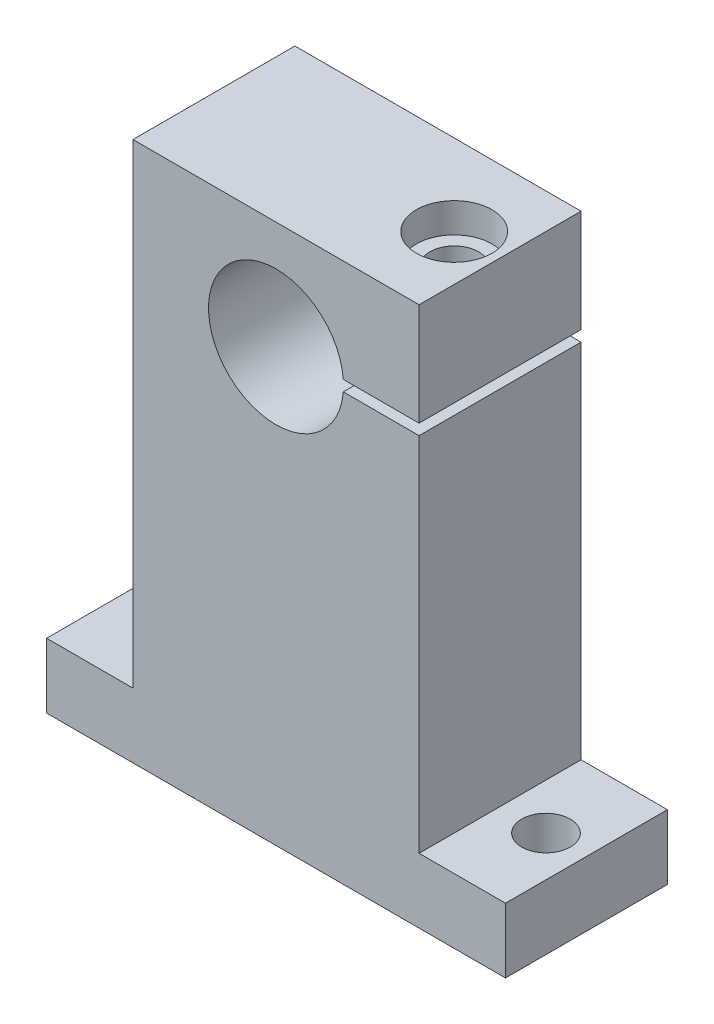
ISO-10303-21;
HEADER;
FILE_DESCRIPTION(('STEP AP214'),'2;1');
FILE_NAME('part.step','',(''),(''),'','','');
FILE_SCHEMA(('AUTOMOTIVE_DESIGN { 1 0 10303 214 1 1 1 1 }'));
ENDSEC;
DATA;
#1=APPLICATION_CONTEXT('core data for automotive mechanical design processes');
#2=APPLICATION_PROTOCOL_DEFINITION('international standard','automotive_design',2000,#1);
#3=PRODUCT_CONTEXT('',#1,'mechanical');
#4=PRODUCT('Part','Part','',(#3));
#5=PRODUCT_RELATED_PRODUCT_CATEGORY('part','',(#4));
#6=PRODUCT_DEFINITION_FORMATION('','',#4);
#7=PRODUCT_DEFINITION_CONTEXT('part definition',#1,'design');
#8=PRODUCT_DEFINITION('design','',#6,#7);
#9=PRODUCT_DEFINITION_SHAPE('','',#8);
#10=(LENGTH_UNIT() NAMED_UNIT(*) SI_UNIT(.MILLI.,.METRE.));
#11=(NAMED_UNIT(*) PLANE_ANGLE_UNIT() SI_UNIT($,.RADIAN.));
#12=(NAMED_UNIT(*) SI_UNIT($,.STERADIAN.) SOLID_ANGLE_UNIT());
#13=UNCERTAINTY_MEASURE_WITH_UNIT(LENGTH_MEASURE(1.E-05),#10,'distance_accuracy_value','');
#14=(GEOMETRIC_REPRESENTATION_CONTEXT(3) GLOBAL_UNCERTAINTY_ASSIGNED_CONTEXT((#13)) GLOBAL_UNIT_ASSIGNED_CONTEXT((#10,
#11,#12)) REPRESENTATION_CONTEXT('',''));
#15=CARTESIAN_POINT('',(0.,0.,0.));
#16=DIRECTION('',(0.,0.,1.));
#17=DIRECTION('',(1.,0.,0.));
#18=AXIS2_PLACEMENT_3D('',#15,#16,#17);
#19=CARTESIAN_POINT('',(26.5,12.,15.));
#20=DIRECTION('',(-1.,0.,0.));
#21=DIRECTION('',(0.,-1.,0.));
#22=AXIS2_PLACEMENT_3D('',#19,#20,#21);
#23=PLANE('',#22);
#24=DIRECTION('',(0.,1.,0.));
#25=VECTOR('',#24,1.);
#26=CARTESIAN_POINT('',(26.5,12.,15.));
#27=LINE('',#26,#25);
#28=CARTESIAN_POINT('',(26.5,81.,15.));
#29=VERTEX_POINT('',#28);
#30=CARTESIAN_POINT('',(26.5,100.,15.));
#31=VERTEX_POINT('',#30);
#32=EDGE_CURVE('E183',#29,#31,#27,.T.);
#33=ORIENTED_EDGE('',*,*,#32,.F.);
#34=DIRECTION('',(0.,0.,-1.));
#35=VECTOR('',#34,1.);
#36=CARTESIAN_POINT('',(26.5,81.,15.));
#37=LINE('',#36,#35);
#38=CARTESIAN_POINT('',(26.5,81.,-15.));
#39=VERTEX_POINT('',#38);
#40=EDGE_CURVE('E155',#29,#39,#37,.T.);
#41=ORIENTED_EDGE('',*,*,#40,.T.);
#42=DIRECTION('',(0.,1.,0.));
#43=VECTOR('',#42,1.);
#44=CARTESIAN_POINT('',(26.5,12.,-15.));
#45=LINE('',#44,#43);
#46=CARTESIAN_POINT('',(26.5,100.,-15.));
#47=VERTEX_POINT('',#46);
#48=EDGE_CURVE('E202',#39,#47,#45,.T.);
#49=ORIENTED_EDGE('',*,*,#48,.T.);
#50=DIRECTION('',(0.,0.,-1.));
#51=VECTOR('',#50,1.);
#52=CARTESIAN_POINT('',(26.5,100.,15.));
#53=LINE('',#52,#51);
#54=EDGE_CURVE('E219',#31,#47,#53,.T.);
#55=ORIENTED_EDGE('',*,*,#54,.F.);
#56=EDGE_LOOP('',(#33,#41,#49,#55));
#57=FACE_BOUND('',#56,.T.);
#58=ADVANCED_FACE('F36',(#57),#23,.F.);
#59=CARTESIAN_POINT('',(-42.5,12.,15.));
#60=DIRECTION('',(0.,0.,-1.));
#61=DIRECTION('',(-1.,0.,0.));
#62=AXIS2_PLACEMENT_3D('',#59,#60,#61);
#63=PLANE('',#62);
#64=CARTESIAN_POINT('',(0.,80.,15.));
#65=DIRECTION('',(0.,0.,1.));
#66=DIRECTION('',(1.,0.,0.));
#67=AXIS2_PLACEMENT_3D('',#64,#65,#66);
#68=CIRCLE('',#67,12.5);
#69=CARTESIAN_POINT('',(12.4599357943771,81.,15.));
#70=VERTEX_POINT('',#69);
#71=CARTESIAN_POINT('',(12.4599357943771,79.,15.));
#72=VERTEX_POINT('',#71);
#73=EDGE_CURVE('E166',#70,#72,#68,.T.);
#74=ORIENTED_EDGE('',*,*,#73,.F.);
#75=DIRECTION('',(-1.,0.,0.));
#76=VECTOR('',#75,1.);
#77=CARTESIAN_POINT('',(60.3456073208911,81.,15.));
#78=LINE('',#77,#76);
#79=EDGE_CURVE('E58',#29,#70,#78,.T.);
#80=ORIENTED_EDGE('',*,*,#79,.F.);
#81=ORIENTED_EDGE('',*,*,#32,.T.);
#82=DIRECTION('',(-1.,0.,0.));
#83=VECTOR('',#82,1.);
#84=CARTESIAN_POINT('',(-26.5,100.,15.));
#85=LINE('',#84,#83);
#86=CARTESIAN_POINT('',(-26.5,100.,15.));
#87=VERTEX_POINT('',#86);
#88=EDGE_CURVE('E187',#31,#87,#85,.T.);
#89=ORIENTED_EDGE('',*,*,#88,.T.);
#90=DIRECTION('',(0.,-1.,0.));
#91=VECTOR('',#90,1.);
#92=CARTESIAN_POINT('',(-26.5,12.,15.));
#93=LINE('',#92,#91);
#94=CARTESIAN_POINT('',(-26.5,12.,15.));
#95=VERTEX_POINT('',#94);
#96=EDGE_CURVE('E189',#87,#95,#93,.T.);
#97=ORIENTED_EDGE('',*,*,#96,.T.);
#98=DIRECTION('',(-1.,0.,0.));
#99=VECTOR('',#98,1.);
#100=CARTESIAN_POINT('',(-42.5,12.,15.));
#101=LINE('',#100,#99);
#102=CARTESIAN_POINT('',(-42.5,12.,15.));
#103=VERTEX_POINT('',#102);
#104=EDGE_CURVE('E191',#95,#103,#101,.T.);
#105=ORIENTED_EDGE('',*,*,#104,.T.);
#106=DIRECTION('',(0.,-1.,0.));
#107=VECTOR('',#106,1.);
#108=CARTESIAN_POINT('',(-42.5,0.,15.));
#109=LINE('',#108,#107);
#110=CARTESIAN_POINT('',(-42.5,0.,15.));
#111=VERTEX_POINT('',#110);
#112=EDGE_CURVE('E173',#103,#111,#109,.T.);
#113=ORIENTED_EDGE('',*,*,#112,.T.);
#114=DIRECTION('',(1.,0.,0.));
#115=VECTOR('',#114,1.);
#116=CARTESIAN_POINT('',(42.5,0.,15.));
#117=LINE('',#116,#115);
#118=CARTESIAN_POINT('',(42.5,0.,15.));
#119=VERTEX_POINT('',#118);
#120=EDGE_CURVE('E176',#111,#119,#117,.T.);
#121=ORIENTED_EDGE('',*,*,#120,.T.);
#122=DIRECTION('',(0.,1.,0.));
#123=VECTOR('',#122,1.);
#124=CARTESIAN_POINT('',(42.5,0.,15.));
#125=LINE('',#124,#123);
#126=CARTESIAN_POINT('',(42.5,12.,15.));
#127=VERTEX_POINT('',#126);
#128=EDGE_CURVE('E179',#119,#127,#125,.T.);
#129=ORIENTED_EDGE('',*,*,#128,.T.);
#130=DIRECTION('',(-1.,0.,0.));
#131=VECTOR('',#130,1.);
#132=CARTESIAN_POINT('',(42.5,12.,15.));
#133=LINE('',#132,#131);
#134=CARTESIAN_POINT('',(26.5,12.,15.));
#135=VERTEX_POINT('',#134);
#136=EDGE_CURVE('E181',#127,#135,#133,.T.);
#137=ORIENTED_EDGE('',*,*,#136,.T.);
#138=CARTESIAN_POINT('',(26.5,79.,15.));
#139=VERTEX_POINT('',#138);
#140=EDGE_CURVE('E184',#135,#139,#27,.T.);
#141=ORIENTED_EDGE('',*,*,#140,.T.);
#142=DIRECTION('',(1.,0.,0.));
#143=VECTOR('',#142,1.);
#144=CARTESIAN_POINT('',(60.3456073208911,79.,15.));
#145=LINE('',#144,#143);
#146=EDGE_CURVE('E139',#72,#139,#145,.T.);
#147=ORIENTED_EDGE('',*,*,#146,.F.);
#148=EDGE_LOOP('',(#74,#80,#81,#89,#97,#105,#113,#121,#129,#137,#141,#147));
#149=FACE_BOUND('',#148,.T.);
#150=ADVANCED_FACE('F243',(#149),#63,.F.);
#151=CARTESIAN_POINT('',(-42.5,12.,-15.));
#152=DIRECTION('',(0.,0.,-1.));
#153=DIRECTION('',(-1.,0.,0.));
#154=AXIS2_PLACEMENT_3D('',#151,#152,#153);
#155=PLANE('',#154);
#156=DIRECTION('',(-1.,0.,0.));
#157=VECTOR('',#156,1.);
#158=CARTESIAN_POINT('',(60.3456073208911,81.,-15.));
#159=LINE('',#158,#157);
#160=CARTESIAN_POINT('',(12.4599357943771,81.,-15.));
#161=VERTEX_POINT('',#160);
#162=EDGE_CURVE('E147',#39,#161,#159,.T.);
#163=ORIENTED_EDGE('',*,*,#162,.T.);
#164=CARTESIAN_POINT('',(0.,80.,-15.));
#165=DIRECTION('',(0.,0.,1.));
#166=DIRECTION('',(1.,0.,0.));
#167=AXIS2_PLACEMENT_3D('',#164,#165,#166);
#168=CIRCLE('',#167,12.5);
#169=CARTESIAN_POINT('',(12.4599357943771,79.,-15.));
#170=VERTEX_POINT('',#169);
#171=EDGE_CURVE('E170',#161,#170,#168,.T.);
#172=ORIENTED_EDGE('',*,*,#171,.T.);
#173=DIRECTION('',(1.,0.,0.));
#174=VECTOR('',#173,1.);
#175=CARTESIAN_POINT('',(60.3456073208911,79.,-15.));
#176=LINE('',#175,#174);
#177=CARTESIAN_POINT('',(26.5,79.,-15.));
#178=VERTEX_POINT('',#177);
#179=EDGE_CURVE('E51',#170,#178,#176,.T.);
#180=ORIENTED_EDGE('',*,*,#179,.T.);
#181=CARTESIAN_POINT('',(26.5,12.,-15.));
#182=VERTEX_POINT('',#181);
#183=EDGE_CURVE('E203',#182,#178,#45,.T.);
#184=ORIENTED_EDGE('',*,*,#183,.F.);
#185=DIRECTION('',(-1.,0.,0.));
#186=VECTOR('',#185,1.);
#187=CARTESIAN_POINT('',(42.5,12.,-15.));
#188=LINE('',#187,#186);
#189=CARTESIAN_POINT('',(42.5,12.,-15.));
#190=VERTEX_POINT('',#189);
#191=EDGE_CURVE('E200',#190,#182,#188,.T.);
#192=ORIENTED_EDGE('',*,*,#191,.F.);
#193=DIRECTION('',(0.,1.,0.));
#194=VECTOR('',#193,1.);
#195=CARTESIAN_POINT('',(42.5,0.,-15.));
#196=LINE('',#195,#194);
#197=CARTESIAN_POINT('',(42.5,0.,-15.));
#198=VERTEX_POINT('',#197);
#199=EDGE_CURVE('E198',#198,#190,#196,.T.);
#200=ORIENTED_EDGE('',*,*,#199,.F.);
#201=DIRECTION('',(1.,0.,0.));
#202=VECTOR('',#201,1.);
#203=CARTESIAN_POINT('',(42.5,0.,-15.));
#204=LINE('',#203,#202);
#205=CARTESIAN_POINT('',(-42.5,0.,-15.));
#206=VERTEX_POINT('',#205);
#207=EDGE_CURVE('E196',#206,#198,#204,.T.);
#208=ORIENTED_EDGE('',*,*,#207,.F.);
#209=DIRECTION('',(0.,-1.,0.));
#210=VECTOR('',#209,1.);
#211=CARTESIAN_POINT('',(-42.5,0.,-15.));
#212=LINE('',#211,#210);
#213=CARTESIAN_POINT('',(-42.5,12.,-15.));
#214=VERTEX_POINT('',#213);
#215=EDGE_CURVE('E169',#214,#206,#212,.T.);
#216=ORIENTED_EDGE('',*,*,#215,.F.);
#217=DIRECTION('',(-1.,0.,0.));
#218=VECTOR('',#217,1.);
#219=CARTESIAN_POINT('',(-42.5,12.,-15.));
#220=LINE('',#219,#218);
#221=CARTESIAN_POINT('',(-26.5,12.,-15.));
#222=VERTEX_POINT('',#221);
#223=EDGE_CURVE('E177',#222,#214,#220,.T.);
#224=ORIENTED_EDGE('',*,*,#223,.F.);
#225=DIRECTION('',(0.,-1.,0.));
#226=VECTOR('',#225,1.);
#227=CARTESIAN_POINT('',(-26.5,12.,-15.));
#228=LINE('',#227,#226);
#229=CARTESIAN_POINT('',(-26.5,100.,-15.));
#230=VERTEX_POINT('',#229);
#231=EDGE_CURVE('E208',#230,#222,#228,.T.);
#232=ORIENTED_EDGE('',*,*,#231,.F.);
#233=DIRECTION('',(-1.,0.,0.));
#234=VECTOR('',#233,1.);
#235=CARTESIAN_POINT('',(-26.5,100.,-15.));
#236=LINE('',#235,#234);
#237=EDGE_CURVE('E206',#47,#230,#236,.T.);
#238=ORIENTED_EDGE('',*,*,#237,.F.);
#239=ORIENTED_EDGE('',*,*,#48,.F.);
#240=EDGE_LOOP('',(#163,#172,#180,#184,#192,#200,#208,#216,#224,#232,#238,#239));
#241=FACE_BOUND('',#240,.T.);
#242=ADVANCED_FACE('F249',(#241),#155,.T.);
#243=CARTESIAN_POINT('',(-42.5,0.,15.));
#244=DIRECTION('',(1.,0.,0.));
#245=DIRECTION('',(0.,1.,0.));
#246=AXIS2_PLACEMENT_3D('',#243,#244,#245);
#247=PLANE('',#246);
#248=ORIENTED_EDGE('',*,*,#215,.T.);
#249=DIRECTION('',(0.,0.,-1.));
#250=VECTOR('',#249,1.);
#251=CARTESIAN_POINT('',(-42.5,0.,15.));
#252=LINE('',#251,#250);
#253=EDGE_CURVE('E231',#111,#206,#252,.T.);
#254=ORIENTED_EDGE('',*,*,#253,.F.);
#255=ORIENTED_EDGE('',*,*,#112,.F.);
#256=DIRECTION('',(0.,0.,-1.));
#257=VECTOR('',#256,1.);
#258=CARTESIAN_POINT('',(-42.5,12.,15.));
#259=LINE('',#258,#257);
#260=EDGE_CURVE('E193',#103,#214,#259,.T.);
#261=ORIENTED_EDGE('',*,*,#260,.T.);
#262=EDGE_LOOP('',(#248,#254,#255,#261));
#263=FACE_BOUND('',#262,.T.);
#264=ADVANCED_FACE('F38',(#263),#247,.F.);
#265=CARTESIAN_POINT('',(42.5,0.,15.));
#266=DIRECTION('',(0.,1.,0.));
#267=DIRECTION('',(-1.,0.,0.));
#268=AXIS2_PLACEMENT_3D('',#265,#266,#267);
#269=PLANE('',#268);
#270=CARTESIAN_POINT('',(-35.,0.,0.));
#271=DIRECTION('',(0.,-1.,0.));
#272=DIRECTION('',(0.,0.,-1.));
#273=AXIS2_PLACEMENT_3D('',#270,#271,#272);
#274=CIRCLE('',#273,4.50000000000001);
#275=CARTESIAN_POINT('',(-35.,0.,-4.50000000000001));
#276=VERTEX_POINT('',#275);
#277=EDGE_CURVE('E158',#276,#276,#274,.T.);
#278=ORIENTED_EDGE('',*,*,#277,.F.);
#279=EDGE_LOOP('',(#278));
#280=FACE_BOUND('',#279,.T.);
#281=CARTESIAN_POINT('',(35.,0.,0.));
#282=DIRECTION('',(0.,-1.,0.));
#283=DIRECTION('',(0.,0.,-1.));
#284=AXIS2_PLACEMENT_3D('',#281,#282,#283);
#285=CIRCLE('',#284,4.50000000000001);
#286=CARTESIAN_POINT('',(35.,0.,-4.50000000000001));
#287=VERTEX_POINT('',#286);
#288=EDGE_CURVE('E162',#287,#287,#285,.T.);
#289=ORIENTED_EDGE('',*,*,#288,.F.);
#290=EDGE_LOOP('',(#289));
#291=FACE_BOUND('',#290,.T.);
#292=ORIENTED_EDGE('',*,*,#207,.T.);
#293=DIRECTION('',(0.,0.,-1.));
#294=VECTOR('',#293,1.);
#295=CARTESIAN_POINT('',(42.5,0.,15.));
#296=LINE('',#295,#294);
#297=EDGE_CURVE('E228',#119,#198,#296,.T.);
#298=ORIENTED_EDGE('',*,*,#297,.F.);
#299=ORIENTED_EDGE('',*,*,#120,.F.);
#300=ORIENTED_EDGE('',*,*,#253,.T.);
#301=EDGE_LOOP('',(#292,#298,#299,#300));
#302=FACE_BOUND('',#301,.T.);
#303=ADVANCED_FACE('F276',(#280,#291,#302),#269,.F.);
#304=CARTESIAN_POINT('',(42.5,0.,15.));
#305=DIRECTION('',(-1.,0.,0.));
#306=DIRECTION('',(0.,-1.,0.));
#307=AXIS2_PLACEMENT_3D('',#304,#305,#306);
#308=PLANE('',#307);
#309=ORIENTED_EDGE('',*,*,#199,.T.);
#310=DIRECTION('',(0.,0.,-1.));
#311=VECTOR('',#310,1.);
#312=CARTESIAN_POINT('',(42.5,12.,15.));
#313=LINE('',#312,#311);
#314=EDGE_CURVE('E225',#127,#190,#313,.T.);
#315=ORIENTED_EDGE('',*,*,#314,.F.);
#316=ORIENTED_EDGE('',*,*,#128,.F.);
#317=ORIENTED_EDGE('',*,*,#297,.T.);
#318=EDGE_LOOP('',(#309,#315,#316,#317));
#319=FACE_BOUND('',#318,.T.);
#320=ADVANCED_FACE('F279',(#319),#308,.F.);
#321=CARTESIAN_POINT('',(42.5,12.,15.));
#322=DIRECTION('',(0.,-1.,0.));
#323=DIRECTION('',(1.,0.,0.));
#324=AXIS2_PLACEMENT_3D('',#321,#322,#323);
#325=PLANE('',#324);
#326=CARTESIAN_POINT('',(35.,12.,0.));
#327=DIRECTION('',(0.,-1.,0.));
#328=DIRECTION('',(1.,0.,0.));
#329=AXIS2_PLACEMENT_3D('',#326,#327,#328);
#330=CIRCLE('',#329,4.50000000000001);
#331=CARTESIAN_POINT('',(39.5,12.,0.));
#332=VERTEX_POINT('',#331);
#333=EDGE_CURVE('E165',#332,#332,#330,.T.);
#334=ORIENTED_EDGE('',*,*,#333,.T.);
#335=EDGE_LOOP('',(#334));
#336=FACE_BOUND('',#335,.T.);
#337=ORIENTED_EDGE('',*,*,#191,.T.);
#338=DIRECTION('',(0.,0.,-1.));
#339=VECTOR('',#338,1.);
#340=CARTESIAN_POINT('',(26.5,12.,15.));
#341=LINE('',#340,#339);
#342=EDGE_CURVE('E222',#135,#182,#341,.T.);
#343=ORIENTED_EDGE('',*,*,#342,.F.);
#344=ORIENTED_EDGE('',*,*,#136,.F.);
#345=ORIENTED_EDGE('',*,*,#314,.T.);
#346=EDGE_LOOP('',(#337,#343,#344,#345));
#347=FACE_BOUND('',#346,.T.);
#348=ADVANCED_FACE('F284',(#336,#347),#325,.F.);
#349=ORIENTED_EDGE('',*,*,#183,.T.);
#350=DIRECTION('',(0.,0.,1.));
#351=VECTOR('',#350,1.);
#352=CARTESIAN_POINT('',(26.5,79.,15.));
#353=LINE('',#352,#351);
#354=EDGE_CURVE('E150',#178,#139,#353,.T.);
#355=ORIENTED_EDGE('',*,*,#354,.T.);
#356=ORIENTED_EDGE('',*,*,#140,.F.);
#357=ORIENTED_EDGE('',*,*,#342,.T.);
#358=EDGE_LOOP('',(#349,#355,#356,#357));
#359=FACE_BOUND('',#358,.T.);
#360=ADVANCED_FACE('F287',(#359),#23,.F.);
#361=CARTESIAN_POINT('',(-26.5,100.,15.));
#362=DIRECTION('',(0.,-1.,0.));
#363=DIRECTION('',(0.,0.,-1.));
#364=AXIS2_PLACEMENT_3D('',#361,#362,#363);
#365=PLANE('',#364);
#366=CARTESIAN_POINT('',(18.,100.,0.));
#367=DIRECTION('',(0.,1.,0.));
#368=DIRECTION('',(0.,0.,1.));
#369=AXIS2_PLACEMENT_3D('',#366,#367,#368);
#370=CIRCLE('',#369,7.);
#371=CARTESIAN_POINT('',(18.,100.,7.));
#372=VERTEX_POINT('',#371);
#373=EDGE_CURVE('E142',#372,#372,#370,.T.);
#374=ORIENTED_EDGE('',*,*,#373,.F.);
#375=EDGE_LOOP('',(#374));
#376=FACE_BOUND('',#375,.T.);
#377=ORIENTED_EDGE('',*,*,#237,.T.);
#378=DIRECTION('',(0.,0.,-1.));
#379=VECTOR('',#378,1.);
#380=CARTESIAN_POINT('',(-26.5,100.,15.));
#381=LINE('',#380,#379);
#382=EDGE_CURVE('E216',#87,#230,#381,.T.);
#383=ORIENTED_EDGE('',*,*,#382,.F.);
#384=ORIENTED_EDGE('',*,*,#88,.F.);
#385=ORIENTED_EDGE('',*,*,#54,.T.);
#386=EDGE_LOOP('',(#377,#383,#384,#385));
#387=FACE_BOUND('',#386,.T.);
#388=ADVANCED_FACE('F257',(#376,#387),#365,.F.);
#389=CARTESIAN_POINT('',(-26.5,12.,15.));
#390=DIRECTION('',(1.,0.,0.));
#391=DIRECTION('',(0.,0.,-1.));
#392=AXIS2_PLACEMENT_3D('',#389,#390,#391);
#393=PLANE('',#392);
#394=ORIENTED_EDGE('',*,*,#231,.T.);
#395=DIRECTION('',(0.,0.,-1.));
#396=VECTOR('',#395,1.);
#397=CARTESIAN_POINT('',(-26.5,12.,15.));
#398=LINE('',#397,#396);
#399=EDGE_CURVE('E213',#95,#222,#398,.T.);
#400=ORIENTED_EDGE('',*,*,#399,.F.);
#401=ORIENTED_EDGE('',*,*,#96,.F.);
#402=ORIENTED_EDGE('',*,*,#382,.T.);
#403=EDGE_LOOP('',(#394,#400,#401,#402));
#404=FACE_BOUND('',#403,.T.);
#405=ADVANCED_FACE('F264',(#404),#393,.F.);
#406=CARTESIAN_POINT('',(-42.5,12.,15.));
#407=DIRECTION('',(0.,-1.,0.));
#408=DIRECTION('',(0.,0.,-1.));
#409=AXIS2_PLACEMENT_3D('',#406,#407,#408);
#410=PLANE('',#409);
#411=CARTESIAN_POINT('',(-35.,12.,0.));
#412=DIRECTION('',(0.,-1.,0.));
#413=DIRECTION('',(0.,0.,-1.));
#414=AXIS2_PLACEMENT_3D('',#411,#412,#413);
#415=CIRCLE('',#414,4.50000000000001);
#416=CARTESIAN_POINT('',(-35.,12.,-4.50000000000001));
#417=VERTEX_POINT('',#416);
#418=EDGE_CURVE('E161',#417,#417,#415,.T.);
#419=ORIENTED_EDGE('',*,*,#418,.T.);
#420=EDGE_LOOP('',(#419));
#421=FACE_BOUND('',#420,.T.);
#422=ORIENTED_EDGE('',*,*,#223,.T.);
#423=ORIENTED_EDGE('',*,*,#260,.F.);
#424=ORIENTED_EDGE('',*,*,#104,.F.);
#425=ORIENTED_EDGE('',*,*,#399,.T.);
#426=EDGE_LOOP('',(#422,#423,#424,#425));
#427=FACE_BOUND('',#426,.T.);
#428=ADVANCED_FACE('F267',(#421,#427),#410,.F.);
#429=CARTESIAN_POINT('',(0.,80.,15.));
#430=DIRECTION('',(0.,0.,-1.));
#431=DIRECTION('',(-1.,0.,0.));
#432=AXIS2_PLACEMENT_3D('',#429,#430,#431);
#433=CYLINDRICAL_SURFACE('',#432,12.5);
#434=DIRECTION('',(0.,0.,-1.));
#435=VECTOR('',#434,1.);
#436=CARTESIAN_POINT('',(12.4599357943771,81.,15.));
#437=LINE('',#436,#435);
#438=EDGE_CURVE('E11',#70,#161,#437,.T.);
#439=ORIENTED_EDGE('',*,*,#438,.F.);
#440=ORIENTED_EDGE('',*,*,#73,.T.);
#441=DIRECTION('',(0.,0.,-1.));
#442=VECTOR('',#441,1.);
#443=CARTESIAN_POINT('',(12.4599357943771,79.,15.));
#444=LINE('',#443,#442);
#445=EDGE_CURVE('E44',#170,#72,#444,.F.);
#446=ORIENTED_EDGE('',*,*,#445,.F.);
#447=ORIENTED_EDGE('',*,*,#171,.F.);
#448=EDGE_LOOP('',(#439,#440,#446,#447));
#449=FACE_BOUND('',#448,.T.);
#450=ADVANCED_FACE('F245',(#449),#433,.F.);
#451=CARTESIAN_POINT('',(35.,0.,0.));
#452=DIRECTION('',(0.,-1.,0.));
#453=DIRECTION('',(0.,0.,-1.));
#454=AXIS2_PLACEMENT_3D('',#451,#452,#453);
#455=CYLINDRICAL_SURFACE('',#454,4.50000000000001);
#456=ORIENTED_EDGE('',*,*,#288,.T.);
#457=EDGE_LOOP('',(#456));
#458=FACE_BOUND('',#457,.T.);
#459=ORIENTED_EDGE('',*,*,#333,.F.);
#460=EDGE_LOOP('',(#459));
#461=FACE_BOUND('',#460,.T.);
#462=ADVANCED_FACE('F328',(#458,#461),#455,.F.);
#463=CARTESIAN_POINT('',(-35.,0.,0.));
#464=DIRECTION('',(0.,-1.,0.));
#465=DIRECTION('',(0.,0.,-1.));
#466=AXIS2_PLACEMENT_3D('',#463,#464,#465);
#467=CYLINDRICAL_SURFACE('',#466,4.50000000000001);
#468=ORIENTED_EDGE('',*,*,#277,.T.);
#469=EDGE_LOOP('',(#468));
#470=FACE_BOUND('',#469,.T.);
#471=ORIENTED_EDGE('',*,*,#418,.F.);
#472=EDGE_LOOP('',(#471));
#473=FACE_BOUND('',#472,.T.);
#474=ADVANCED_FACE('F334',(#470,#473),#467,.F.);
#475=CARTESIAN_POINT('',(60.3456073208911,79.,-15.));
#476=DIRECTION('',(0.,-1.,0.));
#477=DIRECTION('',(1.,0.,0.));
#478=AXIS2_PLACEMENT_3D('',#475,#476,#477);
#479=PLANE('',#478);
#480=CARTESIAN_POINT('',(18.,79.,0.));
#481=DIRECTION('',(0.,-1.,0.));
#482=DIRECTION('',(1.,0.,0.));
#483=AXIS2_PLACEMENT_3D('',#480,#481,#482);
#484=CIRCLE('',#483,4.24999999999999);
#485=CARTESIAN_POINT('',(22.25,79.,0.));
#486=VERTEX_POINT('',#485);
#487=EDGE_CURVE('E135',#486,#486,#484,.T.);
#488=ORIENTED_EDGE('',*,*,#487,.T.);
#489=EDGE_LOOP('',(#488));
#490=FACE_BOUND('',#489,.T.);
#491=ORIENTED_EDGE('',*,*,#179,.F.);
#492=ORIENTED_EDGE('',*,*,#445,.T.);
#493=ORIENTED_EDGE('',*,*,#146,.T.);
#494=ORIENTED_EDGE('',*,*,#354,.F.);
#495=EDGE_LOOP('',(#491,#492,#493,#494));
#496=FACE_BOUND('',#495,.T.);
#497=ADVANCED_FACE('F238',(#490,#496),#479,.F.);
#498=CARTESIAN_POINT('',(60.3456073208911,81.,-15.));
#499=DIRECTION('',(0.,1.,0.));
#500=DIRECTION('',(-1.,0.,0.));
#501=AXIS2_PLACEMENT_3D('',#498,#499,#500);
#502=PLANE('',#501);
#503=CARTESIAN_POINT('',(18.,81.,0.));
#504=DIRECTION('',(0.,1.,0.));
#505=DIRECTION('',(-1.,0.,0.));
#506=AXIS2_PLACEMENT_3D('',#503,#504,#505);
#507=CIRCLE('',#506,4.5);
#508=CARTESIAN_POINT('',(13.5,81.,0.));
#509=VERTEX_POINT('',#508);
#510=EDGE_CURVE('E521',#509,#509,#507,.F.);
#511=ORIENTED_EDGE('',*,*,#510,.F.);
#512=EDGE_LOOP('',(#511));
#513=FACE_BOUND('',#512,.T.);
#514=ORIENTED_EDGE('',*,*,#79,.T.);
#515=ORIENTED_EDGE('',*,*,#438,.T.);
#516=ORIENTED_EDGE('',*,*,#162,.F.);
#517=ORIENTED_EDGE('',*,*,#40,.F.);
#518=EDGE_LOOP('',(#514,#515,#516,#517));
#519=FACE_BOUND('',#518,.T.);
#520=ADVANCED_FACE('F246',(#513,#519),#502,.F.);
#521=CARTESIAN_POINT('',(18.,100.,0.));
#522=DIRECTION('',(0.,1.,0.));
#523=DIRECTION('',(0.,0.,1.));
#524=AXIS2_PLACEMENT_3D('',#521,#522,#523);
#525=CYLINDRICAL_SURFACE('',#524,7.);
#526=CARTESIAN_POINT('',(18.,94.5,0.));
#527=DIRECTION('',(0.,1.,0.));
#528=DIRECTION('',(0.,0.,1.));
#529=AXIS2_PLACEMENT_3D('',#526,#527,#528);
#530=CIRCLE('',#529,7.);
#531=CARTESIAN_POINT('',(18.,94.5,7.));
#532=VERTEX_POINT('',#531);
#533=EDGE_CURVE('E136',#532,#532,#530,.T.);
#534=ORIENTED_EDGE('',*,*,#533,.F.);
#535=EDGE_LOOP('',(#534));
#536=FACE_BOUND('',#535,.T.);
#537=ORIENTED_EDGE('',*,*,#373,.T.);
#538=EDGE_LOOP('',(#537));
#539=FACE_BOUND('',#538,.T.);
#540=ADVANCED_FACE('F355',(#536,#539),#525,.F.);
#541=CARTESIAN_POINT('',(22.25,94.5,0.));
#542=DIRECTION('',(0.,-1.,0.));
#543=DIRECTION('',(0.,0.,-1.));
#544=AXIS2_PLACEMENT_3D('',#541,#542,#543);
#545=PLANE('',#544);
#546=CARTESIAN_POINT('',(18.,94.5,0.));
#547=DIRECTION('',(0.,1.,0.));
#548=DIRECTION('',(0.,0.,1.));
#549=AXIS2_PLACEMENT_3D('',#546,#547,#548);
#550=CIRCLE('',#549,4.5);
#551=CARTESIAN_POINT('',(18.,94.5,4.50000000000001));
#552=VERTEX_POINT('',#551);
#553=EDGE_CURVE('E518',#552,#552,#550,.T.);
#554=ORIENTED_EDGE('',*,*,#553,.F.);
#555=EDGE_LOOP('',(#554));
#556=FACE_BOUND('',#555,.T.);
#557=ORIENTED_EDGE('',*,*,#533,.T.);
#558=EDGE_LOOP('',(#557));
#559=FACE_BOUND('',#558,.T.);
#560=ADVANCED_FACE('F363',(#556,#559),#545,.F.);
#561=CARTESIAN_POINT('',(18.,100.,0.));
#562=DIRECTION('',(0.,1.,0.));
#563=DIRECTION('',(0.,0.,1.));
#564=AXIS2_PLACEMENT_3D('',#561,#562,#563);
#565=CYLINDRICAL_SURFACE('',#564,4.24999999999999);
#566=CARTESIAN_POINT('',(18.,65.,0.));
#567=DIRECTION('',(0.,1.,0.));
#568=DIRECTION('',(0.,0.,1.));
#569=AXIS2_PLACEMENT_3D('',#566,#567,#568);
#570=CIRCLE('',#569,4.24999999999999);
#571=CARTESIAN_POINT('',(18.,65.,4.24999999999999));
#572=VERTEX_POINT('',#571);
#573=EDGE_CURVE('E133',#572,#572,#570,.T.);
#574=ORIENTED_EDGE('',*,*,#573,.F.);
#575=EDGE_LOOP('',(#574));
#576=FACE_BOUND('',#575,.T.);
#577=ORIENTED_EDGE('',*,*,#487,.F.);
#578=EDGE_LOOP('',(#577));
#579=FACE_BOUND('',#578,.T.);
#580=ADVANCED_FACE('F129',(#576,#579),#565,.F.);
#581=CARTESIAN_POINT('',(18.,65.,0.));
#582=DIRECTION('',(0.,1.,0.));
#583=DIRECTION('',(0.,0.,1.));
#584=AXIS2_PLACEMENT_3D('',#581,#582,#583);
#585=CONICAL_SURFACE('',#584,4.24999999999999,1.02974425867665);
#586=CARTESIAN_POINT('',(18.,62.4463423691328,0.));
#587=VERTEX_POINT('',#586);
#588=VERTEX_LOOP('',#587);
#589=FACE_BOUND('',#588,.T.);
#590=ORIENTED_EDGE('',*,*,#573,.T.);
#591=EDGE_LOOP('',(#590));
#592=FACE_BOUND('',#591,.T.);
#593=ADVANCED_FACE('F125',(#589,#592),#585,.F.);
#594=CARTESIAN_POINT('',(18.,-0.00100000000001488,0.));
#595=DIRECTION('',(0.,1.,0.));
#596=DIRECTION('',(0.,0.,1.));
#597=AXIS2_PLACEMENT_3D('',#594,#595,#596);
#598=CYLINDRICAL_SURFACE('',#597,4.5);
#599=ORIENTED_EDGE('',*,*,#553,.T.);
#600=EDGE_LOOP('',(#599));
#601=FACE_BOUND('',#600,.T.);
#602=ORIENTED_EDGE('',*,*,#510,.T.);
#603=EDGE_LOOP('',(#602));
#604=FACE_BOUND('',#603,.T.);
#605=ADVANCED_FACE('F128',(#601,#604),#598,.F.);
#606=CLOSED_SHELL('',(#58,#150,#242,#264,#303,#320,#348,#360,#388,#405,#428,#450,#462,#474,#497,
#520,#540,#560,#580,#593,#605));
#607=MANIFOLD_SOLID_BREP('B2',#606);
#608=ADVANCED_BREP_SHAPE_REPRESENTATION('',(#18,#607),#14);
#609=SHAPE_DEFINITION_REPRESENTATION(#9,#608);
ENDSEC;
END-ISO-10303-21;
